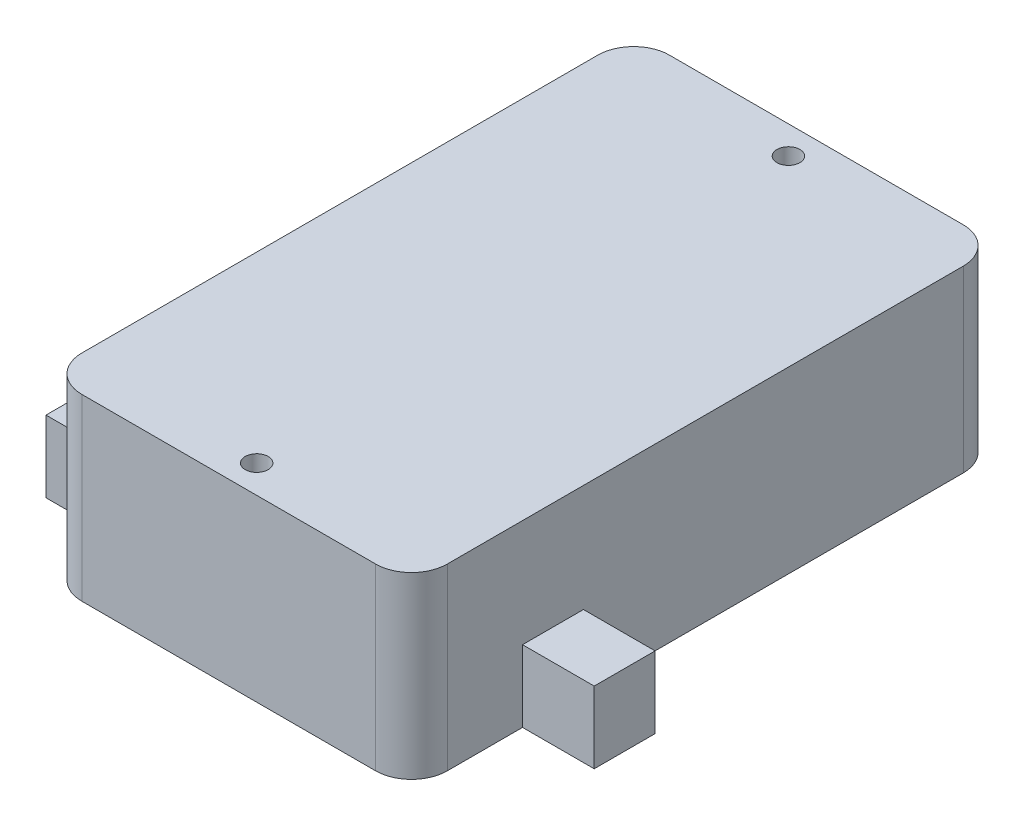
ISO-10303-21;
HEADER;
FILE_DESCRIPTION(('STEP AP214'),'2;1');
FILE_NAME('part.step','',(''),(''),'','','');
FILE_SCHEMA(('AUTOMOTIVE_DESIGN { 1 0 10303 214 1 1 1 1 }'));
ENDSEC;
DATA;
#1=APPLICATION_CONTEXT('core data for automotive mechanical design processes');
#2=APPLICATION_PROTOCOL_DEFINITION('international standard','automotive_design',2000,#1);
#3=PRODUCT_CONTEXT('',#1,'mechanical');
#4=PRODUCT('Part','Part','',(#3));
#5=PRODUCT_RELATED_PRODUCT_CATEGORY('part','',(#4));
#6=PRODUCT_DEFINITION_FORMATION('','',#4);
#7=PRODUCT_DEFINITION_CONTEXT('part definition',#1,'design');
#8=PRODUCT_DEFINITION('design','',#6,#7);
#9=PRODUCT_DEFINITION_SHAPE('','',#8);
#10=(LENGTH_UNIT() NAMED_UNIT(*) SI_UNIT(.MILLI.,.METRE.));
#11=(NAMED_UNIT(*) PLANE_ANGLE_UNIT() SI_UNIT($,.RADIAN.));
#12=(NAMED_UNIT(*) SI_UNIT($,.STERADIAN.) SOLID_ANGLE_UNIT());
#13=UNCERTAINTY_MEASURE_WITH_UNIT(LENGTH_MEASURE(1.E-05),#10,'distance_accuracy_value','');
#14=(GEOMETRIC_REPRESENTATION_CONTEXT(3) GLOBAL_UNCERTAINTY_ASSIGNED_CONTEXT((#13)) GLOBAL_UNIT_ASSIGNED_CONTEXT((#10,
#11,#12)) REPRESENTATION_CONTEXT('',''));
#15=CARTESIAN_POINT('',(0.,0.,0.));
#16=DIRECTION('',(0.,0.,1.));
#17=DIRECTION('',(1.,0.,0.));
#18=AXIS2_PLACEMENT_3D('',#15,#16,#17);
#19=CARTESIAN_POINT('',(25.5,25.,0.));
#20=DIRECTION('',(-1.,0.,0.));
#21=DIRECTION('',(0.,0.,1.));
#22=AXIS2_PLACEMENT_3D('',#19,#20,#21);
#23=PLANE('',#22);
#24=DIRECTION('',(0.,0.,-1.));
#25=VECTOR('',#24,1.);
#26=CARTESIAN_POINT('',(25.5,0.,0.));
#27=LINE('',#26,#25);
#28=CARTESIAN_POINT('',(25.5,0.,17.));
#29=VERTEX_POINT('',#28);
#30=CARTESIAN_POINT('',(25.5,0.,-36.));
#31=VERTEX_POINT('',#30);
#32=EDGE_CURVE('E229',#29,#31,#27,.T.);
#33=ORIENTED_EDGE('',*,*,#32,.T.);
#34=DIRECTION('',(0.,-1.,0.));
#35=VECTOR('',#34,1.);
#36=CARTESIAN_POINT('',(25.5,25.,-36.));
#37=LINE('',#36,#35);
#38=CARTESIAN_POINT('',(25.5,25.,-36.));
#39=VERTEX_POINT('',#38);
#40=EDGE_CURVE('E48',#31,#39,#37,.F.);
#41=ORIENTED_EDGE('',*,*,#40,.T.);
#42=DIRECTION('',(0.,0.,-1.));
#43=VECTOR('',#42,1.);
#44=CARTESIAN_POINT('',(25.5,25.,0.));
#45=LINE('',#44,#43);
#46=CARTESIAN_POINT('',(25.5,25.,36.));
#47=VERTEX_POINT('',#46);
#48=EDGE_CURVE('E211',#47,#39,#45,.T.);
#49=ORIENTED_EDGE('',*,*,#48,.F.);
#50=DIRECTION('',(0.,-1.,0.));
#51=VECTOR('',#50,1.);
#52=CARTESIAN_POINT('',(25.5,25.,36.));
#53=LINE('',#52,#51);
#54=CARTESIAN_POINT('',(25.5,0.,36.));
#55=VERTEX_POINT('',#54);
#56=EDGE_CURVE('E267',#47,#55,#53,.T.);
#57=ORIENTED_EDGE('',*,*,#56,.T.);
#58=CARTESIAN_POINT('',(25.5,0.,25.5));
#59=VERTEX_POINT('',#58);
#60=EDGE_CURVE('E230',#55,#59,#27,.T.);
#61=ORIENTED_EDGE('',*,*,#60,.T.);
#62=DIRECTION('',(0.,-1.,0.));
#63=VECTOR('',#62,1.);
#64=CARTESIAN_POINT('',(25.5,10.,25.5));
#65=LINE('',#64,#63);
#66=CARTESIAN_POINT('',(25.5,10.,25.5));
#67=VERTEX_POINT('',#66);
#68=EDGE_CURVE('E192',#67,#59,#65,.T.);
#69=ORIENTED_EDGE('',*,*,#68,.F.);
#70=DIRECTION('',(0.,0.,-1.));
#71=VECTOR('',#70,1.);
#72=CARTESIAN_POINT('',(25.5,10.,0.));
#73=LINE('',#72,#71);
#74=CARTESIAN_POINT('',(25.5,10.,17.));
#75=VERTEX_POINT('',#74);
#76=EDGE_CURVE('E190',#67,#75,#73,.T.);
#77=ORIENTED_EDGE('',*,*,#76,.T.);
#78=DIRECTION('',(0.,-1.,0.));
#79=VECTOR('',#78,1.);
#80=CARTESIAN_POINT('',(25.5,10.,17.));
#81=LINE('',#80,#79);
#82=EDGE_CURVE('E200',#75,#29,#81,.T.);
#83=ORIENTED_EDGE('',*,*,#82,.T.);
#84=EDGE_LOOP('',(#33,#41,#49,#57,#61,#69,#77,#83));
#85=FACE_BOUND('',#84,.T.);
#86=ADVANCED_FACE('F33',(#85),#23,.F.);
#87=CARTESIAN_POINT('',(0.,25.,41.));
#88=DIRECTION('',(0.,0.,-1.));
#89=DIRECTION('',(-1.,0.,0.));
#90=AXIS2_PLACEMENT_3D('',#87,#88,#89);
#91=PLANE('',#90);
#92=DIRECTION('',(1.,0.,0.));
#93=VECTOR('',#92,1.);
#94=CARTESIAN_POINT('',(0.,0.,41.));
#95=LINE('',#94,#93);
#96=CARTESIAN_POINT('',(-20.5,0.,41.));
#97=VERTEX_POINT('',#96);
#98=CARTESIAN_POINT('',(20.5,0.,41.));
#99=VERTEX_POINT('',#98);
#100=EDGE_CURVE('E208',#97,#99,#95,.T.);
#101=ORIENTED_EDGE('',*,*,#100,.T.);
#102=DIRECTION('',(0.,-1.,0.));
#103=VECTOR('',#102,1.);
#104=CARTESIAN_POINT('',(20.5,25.,41.));
#105=LINE('',#104,#103);
#106=CARTESIAN_POINT('',(20.5,25.,41.));
#107=VERTEX_POINT('',#106);
#108=EDGE_CURVE('E11',#99,#107,#105,.F.);
#109=ORIENTED_EDGE('',*,*,#108,.T.);
#110=DIRECTION('',(1.,0.,0.));
#111=VECTOR('',#110,1.);
#112=CARTESIAN_POINT('',(0.,25.,41.));
#113=LINE('',#112,#111);
#114=CARTESIAN_POINT('',(-20.5,25.,41.));
#115=VERTEX_POINT('',#114);
#116=EDGE_CURVE('E209',#115,#107,#113,.T.);
#117=ORIENTED_EDGE('',*,*,#116,.F.);
#118=DIRECTION('',(0.,-1.,0.));
#119=VECTOR('',#118,1.);
#120=CARTESIAN_POINT('',(-20.5,0.,41.));
#121=LINE('',#120,#119);
#122=EDGE_CURVE('E41',#115,#97,#121,.T.);
#123=ORIENTED_EDGE('',*,*,#122,.T.);
#124=EDGE_LOOP('',(#101,#109,#117,#123));
#125=FACE_BOUND('',#124,.T.);
#126=ADVANCED_FACE('F275',(#125),#91,.F.);
#127=CARTESIAN_POINT('',(0.,25.,-41.));
#128=DIRECTION('',(0.,0.,-1.));
#129=DIRECTION('',(-1.,0.,0.));
#130=AXIS2_PLACEMENT_3D('',#127,#128,#129);
#131=PLANE('',#130);
#132=DIRECTION('',(1.,0.,0.));
#133=VECTOR('',#132,1.);
#134=CARTESIAN_POINT('',(0.,0.,-41.));
#135=LINE('',#134,#133);
#136=CARTESIAN_POINT('',(-20.5,0.,-41.));
#137=VERTEX_POINT('',#136);
#138=CARTESIAN_POINT('',(20.5,0.,-41.));
#139=VERTEX_POINT('',#138);
#140=EDGE_CURVE('E232',#137,#139,#135,.T.);
#141=ORIENTED_EDGE('',*,*,#140,.F.);
#142=DIRECTION('',(0.,-1.,0.));
#143=VECTOR('',#142,1.);
#144=CARTESIAN_POINT('',(-20.5,25.,-41.));
#145=LINE('',#144,#143);
#146=CARTESIAN_POINT('',(-20.5,25.,-41.));
#147=VERTEX_POINT('',#146);
#148=EDGE_CURVE('E258',#137,#147,#145,.F.);
#149=ORIENTED_EDGE('',*,*,#148,.T.);
#150=DIRECTION('',(1.,0.,0.));
#151=VECTOR('',#150,1.);
#152=CARTESIAN_POINT('',(0.,25.,-41.));
#153=LINE('',#152,#151);
#154=CARTESIAN_POINT('',(20.5,25.,-41.));
#155=VERTEX_POINT('',#154);
#156=EDGE_CURVE('E214',#147,#155,#153,.T.);
#157=ORIENTED_EDGE('',*,*,#156,.T.);
#158=DIRECTION('',(0.,-1.,0.));
#159=VECTOR('',#158,1.);
#160=CARTESIAN_POINT('',(20.5,0.,-41.));
#161=LINE('',#160,#159);
#162=EDGE_CURVE('E255',#155,#139,#161,.T.);
#163=ORIENTED_EDGE('',*,*,#162,.T.);
#164=EDGE_LOOP('',(#141,#149,#157,#163));
#165=FACE_BOUND('',#164,.T.);
#166=ADVANCED_FACE('F299',(#165),#131,.T.);
#167=CARTESIAN_POINT('',(0.,25.,37.1));
#168=DIRECTION('',(0.,-1.,0.));
#169=DIRECTION('',(0.,0.,-1.));
#170=AXIS2_PLACEMENT_3D('',#167,#168,#169);
#171=CYLINDRICAL_SURFACE('',#170,1.6);
#172=CARTESIAN_POINT('',(0.,25.,37.1));
#173=DIRECTION('',(0.,1.,0.));
#174=DIRECTION('',(0.,0.,1.));
#175=AXIS2_PLACEMENT_3D('',#172,#173,#174);
#176=CIRCLE('',#175,1.6);
#177=CARTESIAN_POINT('',(0.,25.,38.7));
#178=VERTEX_POINT('',#177);
#179=EDGE_CURVE('E220',#178,#178,#176,.T.);
#180=ORIENTED_EDGE('',*,*,#179,.T.);
#181=EDGE_LOOP('',(#180));
#182=FACE_BOUND('',#181,.T.);
#183=CARTESIAN_POINT('',(0.,0.,37.1));
#184=DIRECTION('',(0.,1.,0.));
#185=DIRECTION('',(0.,0.,1.));
#186=AXIS2_PLACEMENT_3D('',#183,#184,#185);
#187=CIRCLE('',#186,1.6);
#188=CARTESIAN_POINT('',(0.,0.,38.7));
#189=VERTEX_POINT('',#188);
#190=EDGE_CURVE('E238',#189,#189,#187,.T.);
#191=ORIENTED_EDGE('',*,*,#190,.F.);
#192=EDGE_LOOP('',(#191));
#193=FACE_BOUND('',#192,.T.);
#194=ADVANCED_FACE('F458',(#182,#193),#171,.F.);
#195=CARTESIAN_POINT('',(-25.5,25.,0.));
#196=DIRECTION('',(-1.,0.,0.));
#197=DIRECTION('',(0.,0.,1.));
#198=AXIS2_PLACEMENT_3D('',#195,#196,#197);
#199=PLANE('',#198);
#200=DIRECTION('',(0.,0.,-1.));
#201=VECTOR('',#200,1.);
#202=CARTESIAN_POINT('',(-25.5,25.,0.));
#203=LINE('',#202,#201);
#204=CARTESIAN_POINT('',(-25.5,25.,36.));
#205=VERTEX_POINT('',#204);
#206=CARTESIAN_POINT('',(-25.5,25.,-36.));
#207=VERTEX_POINT('',#206);
#208=EDGE_CURVE('E217',#205,#207,#203,.T.);
#209=ORIENTED_EDGE('',*,*,#208,.T.);
#210=DIRECTION('',(0.,-1.,0.));
#211=VECTOR('',#210,1.);
#212=CARTESIAN_POINT('',(-25.5,25.,-36.));
#213=LINE('',#212,#211);
#214=CARTESIAN_POINT('',(-25.5,0.,-36.));
#215=VERTEX_POINT('',#214);
#216=EDGE_CURVE('E244',#207,#215,#213,.T.);
#217=ORIENTED_EDGE('',*,*,#216,.T.);
#218=DIRECTION('',(0.,0.,-1.));
#219=VECTOR('',#218,1.);
#220=CARTESIAN_POINT('',(-25.5,0.,0.));
#221=LINE('',#220,#219);
#222=CARTESIAN_POINT('',(-25.5,0.,5.));
#223=VERTEX_POINT('',#222);
#224=EDGE_CURVE('E235',#223,#215,#221,.T.);
#225=ORIENTED_EDGE('',*,*,#224,.F.);
#226=DIRECTION('',(0.,-1.,0.));
#227=VECTOR('',#226,1.);
#228=CARTESIAN_POINT('',(-25.5,10.,5.));
#229=LINE('',#228,#227);
#230=CARTESIAN_POINT('',(-25.5,10.,5.));
#231=VERTEX_POINT('',#230);
#232=EDGE_CURVE('E512',#231,#223,#229,.T.);
#233=ORIENTED_EDGE('',*,*,#232,.F.);
#234=DIRECTION('',(0.,0.,-1.));
#235=VECTOR('',#234,1.);
#236=CARTESIAN_POINT('',(-25.5,10.,0.));
#237=LINE('',#236,#235);
#238=CARTESIAN_POINT('',(-25.5,10.,31.));
#239=VERTEX_POINT('',#238);
#240=EDGE_CURVE('E164',#239,#231,#237,.T.);
#241=ORIENTED_EDGE('',*,*,#240,.F.);
#242=DIRECTION('',(0.,-1.,0.));
#243=VECTOR('',#242,1.);
#244=CARTESIAN_POINT('',(-25.5,10.,31.));
#245=LINE('',#244,#243);
#246=CARTESIAN_POINT('',(-25.5,0.,31.));
#247=VERTEX_POINT('',#246);
#248=EDGE_CURVE('E177',#239,#247,#245,.T.);
#249=ORIENTED_EDGE('',*,*,#248,.T.);
#250=CARTESIAN_POINT('',(-25.5,0.,36.));
#251=VERTEX_POINT('',#250);
#252=EDGE_CURVE('E236',#251,#247,#221,.T.);
#253=ORIENTED_EDGE('',*,*,#252,.F.);
#254=DIRECTION('',(0.,-1.,0.));
#255=VECTOR('',#254,1.);
#256=CARTESIAN_POINT('',(-25.5,25.,36.));
#257=LINE('',#256,#255);
#258=EDGE_CURVE('E226',#251,#205,#257,.F.);
#259=ORIENTED_EDGE('',*,*,#258,.T.);
#260=EDGE_LOOP('',(#209,#217,#225,#233,#241,#249,#253,#259));
#261=FACE_BOUND('',#260,.T.);
#262=ADVANCED_FACE('F308',(#261),#199,.T.);
#263=CARTESIAN_POINT('',(0.,25.,-37.1));
#264=DIRECTION('',(0.,-1.,0.));
#265=DIRECTION('',(0.,0.,-1.));
#266=AXIS2_PLACEMENT_3D('',#263,#264,#265);
#267=CYLINDRICAL_SURFACE('',#266,1.6);
#268=CARTESIAN_POINT('',(0.,25.,-37.1));
#269=DIRECTION('',(0.,1.,0.));
#270=DIRECTION('',(0.,0.,1.));
#271=AXIS2_PLACEMENT_3D('',#268,#269,#270);
#272=CIRCLE('',#271,1.6);
#273=CARTESIAN_POINT('',(0.,25.,-35.5));
#274=VERTEX_POINT('',#273);
#275=EDGE_CURVE('E223',#274,#274,#272,.F.);
#276=ORIENTED_EDGE('',*,*,#275,.F.);
#277=EDGE_LOOP('',(#276));
#278=FACE_BOUND('',#277,.T.);
#279=CARTESIAN_POINT('',(0.,0.,-37.1));
#280=DIRECTION('',(0.,1.,0.));
#281=DIRECTION('',(0.,0.,1.));
#282=AXIS2_PLACEMENT_3D('',#279,#280,#281);
#283=CIRCLE('',#282,1.6);
#284=CARTESIAN_POINT('',(0.,0.,-35.5));
#285=VERTEX_POINT('',#284);
#286=EDGE_CURVE('E212',#285,#285,#283,.F.);
#287=ORIENTED_EDGE('',*,*,#286,.T.);
#288=EDGE_LOOP('',(#287));
#289=FACE_BOUND('',#288,.T.);
#290=ADVANCED_FACE('F442',(#278,#289),#267,.F.);
#291=CARTESIAN_POINT('',(0.,25.,0.));
#292=DIRECTION('',(0.,1.,0.));
#293=DIRECTION('',(0.,0.,1.));
#294=AXIS2_PLACEMENT_3D('',#291,#292,#293);
#295=PLANE('',#294);
#296=ORIENTED_EDGE('',*,*,#156,.F.);
#297=CARTESIAN_POINT('',(-20.5,25.,-36.));
#298=DIRECTION('',(0.,1.,0.));
#299=DIRECTION('',(0.,0.,1.));
#300=AXIS2_PLACEMENT_3D('',#297,#298,#299);
#301=CIRCLE('',#300,5.);
#302=EDGE_CURVE('E265',#147,#207,#301,.T.);
#303=ORIENTED_EDGE('',*,*,#302,.T.);
#304=ORIENTED_EDGE('',*,*,#208,.F.);
#305=CARTESIAN_POINT('',(-20.5,25.,36.));
#306=DIRECTION('',(0.,1.,0.));
#307=DIRECTION('',(0.,0.,1.));
#308=AXIS2_PLACEMENT_3D('',#305,#306,#307);
#309=CIRCLE('',#308,5.);
#310=EDGE_CURVE('E260',#205,#115,#309,.T.);
#311=ORIENTED_EDGE('',*,*,#310,.T.);
#312=ORIENTED_EDGE('',*,*,#116,.T.);
#313=CARTESIAN_POINT('',(20.5,25.,36.));
#314=DIRECTION('',(0.,1.,0.));
#315=DIRECTION('',(0.,0.,1.));
#316=AXIS2_PLACEMENT_3D('',#313,#314,#315);
#317=CIRCLE('',#316,5.);
#318=EDGE_CURVE('E55',#107,#47,#317,.T.);
#319=ORIENTED_EDGE('',*,*,#318,.T.);
#320=ORIENTED_EDGE('',*,*,#48,.T.);
#321=CARTESIAN_POINT('',(20.5,25.,-36.));
#322=DIRECTION('',(0.,1.,0.));
#323=DIRECTION('',(0.,0.,1.));
#324=AXIS2_PLACEMENT_3D('',#321,#322,#323);
#325=CIRCLE('',#324,5.);
#326=EDGE_CURVE('E263',#39,#155,#325,.T.);
#327=ORIENTED_EDGE('',*,*,#326,.T.);
#328=EDGE_LOOP('',(#296,#303,#304,#311,#312,#319,#320,#327));
#329=FACE_BOUND('',#328,.T.);
#330=ORIENTED_EDGE('',*,*,#179,.F.);
#331=EDGE_LOOP('',(#330));
#332=FACE_BOUND('',#331,.T.);
#333=ORIENTED_EDGE('',*,*,#275,.T.);
#334=EDGE_LOOP('',(#333));
#335=FACE_BOUND('',#334,.T.);
#336=ADVANCED_FACE('F292',(#329,#332,#335),#295,.T.);
#337=CARTESIAN_POINT('',(0.,0.,0.));
#338=DIRECTION('',(0.,1.,0.));
#339=DIRECTION('',(0.,0.,1.));
#340=AXIS2_PLACEMENT_3D('',#337,#338,#339);
#341=PLANE('',#340);
#342=ORIENTED_EDGE('',*,*,#224,.T.);
#343=CARTESIAN_POINT('',(-20.5,0.,-36.));
#344=DIRECTION('',(0.,1.,0.));
#345=DIRECTION('',(0.,0.,1.));
#346=AXIS2_PLACEMENT_3D('',#343,#344,#345);
#347=CIRCLE('',#346,5.);
#348=EDGE_CURVE('E253',#215,#137,#347,.F.);
#349=ORIENTED_EDGE('',*,*,#348,.T.);
#350=ORIENTED_EDGE('',*,*,#140,.T.);
#351=CARTESIAN_POINT('',(20.5,0.,-36.));
#352=DIRECTION('',(0.,1.,0.));
#353=DIRECTION('',(0.,0.,1.));
#354=AXIS2_PLACEMENT_3D('',#351,#352,#353);
#355=CIRCLE('',#354,5.);
#356=EDGE_CURVE('E251',#139,#31,#355,.F.);
#357=ORIENTED_EDGE('',*,*,#356,.T.);
#358=ORIENTED_EDGE('',*,*,#32,.F.);
#359=DIRECTION('',(1.,0.,0.));
#360=VECTOR('',#359,1.);
#361=CARTESIAN_POINT('',(0.,0.,17.));
#362=LINE('',#361,#360);
#363=CARTESIAN_POINT('',(35.5,0.,17.));
#364=VERTEX_POINT('',#363);
#365=EDGE_CURVE('E185',#29,#364,#362,.T.);
#366=ORIENTED_EDGE('',*,*,#365,.T.);
#367=DIRECTION('',(0.,0.,-1.));
#368=VECTOR('',#367,1.);
#369=CARTESIAN_POINT('',(35.5,0.,0.));
#370=LINE('',#369,#368);
#371=CARTESIAN_POINT('',(35.5,0.,25.5));
#372=VERTEX_POINT('',#371);
#373=EDGE_CURVE('E175',#372,#364,#370,.T.);
#374=ORIENTED_EDGE('',*,*,#373,.F.);
#375=DIRECTION('',(1.,0.,0.));
#376=VECTOR('',#375,1.);
#377=CARTESIAN_POINT('',(0.,0.,25.5));
#378=LINE('',#377,#376);
#379=EDGE_CURVE('E172',#59,#372,#378,.T.);
#380=ORIENTED_EDGE('',*,*,#379,.F.);
#381=ORIENTED_EDGE('',*,*,#60,.F.);
#382=CARTESIAN_POINT('',(20.5,0.,36.));
#383=DIRECTION('',(0.,1.,0.));
#384=DIRECTION('',(0.,0.,1.));
#385=AXIS2_PLACEMENT_3D('',#382,#383,#384);
#386=CIRCLE('',#385,5.);
#387=EDGE_CURVE('E249',#55,#99,#386,.F.);
#388=ORIENTED_EDGE('',*,*,#387,.T.);
#389=ORIENTED_EDGE('',*,*,#100,.F.);
#390=CARTESIAN_POINT('',(-20.5,0.,36.));
#391=DIRECTION('',(0.,1.,0.));
#392=DIRECTION('',(0.,0.,1.));
#393=AXIS2_PLACEMENT_3D('',#390,#391,#392);
#394=CIRCLE('',#393,5.);
#395=EDGE_CURVE('E247',#97,#251,#394,.F.);
#396=ORIENTED_EDGE('',*,*,#395,.T.);
#397=ORIENTED_EDGE('',*,*,#252,.T.);
#398=DIRECTION('',(-1.,0.,0.));
#399=VECTOR('',#398,1.);
#400=CARTESIAN_POINT('',(0.,0.,31.));
#401=LINE('',#400,#399);
#402=CARTESIAN_POINT('',(-35.5,0.,31.));
#403=VERTEX_POINT('',#402);
#404=EDGE_CURVE('E167',#247,#403,#401,.T.);
#405=ORIENTED_EDGE('',*,*,#404,.T.);
#406=DIRECTION('',(0.,0.,1.));
#407=VECTOR('',#406,1.);
#408=CARTESIAN_POINT('',(-35.5,0.,0.));
#409=LINE('',#408,#407);
#410=CARTESIAN_POINT('',(-35.5,0.,5.00000000000001));
#411=VERTEX_POINT('',#410);
#412=EDGE_CURVE('E510',#411,#403,#409,.T.);
#413=ORIENTED_EDGE('',*,*,#412,.F.);
#414=DIRECTION('',(-1.,0.,0.));
#415=VECTOR('',#414,1.);
#416=CARTESIAN_POINT('',(0.,0.,5.));
#417=LINE('',#416,#415);
#418=EDGE_CURVE('E171',#223,#411,#417,.T.);
#419=ORIENTED_EDGE('',*,*,#418,.F.);
#420=EDGE_LOOP('',(#342,#349,#350,#357,#358,#366,#374,#380,#381,#388,#389,#396,#397,#405,#413,#419));
#421=FACE_BOUND('',#420,.T.);
#422=ORIENTED_EDGE('',*,*,#190,.T.);
#423=EDGE_LOOP('',(#422));
#424=FACE_BOUND('',#423,.T.);
#425=ORIENTED_EDGE('',*,*,#286,.F.);
#426=EDGE_LOOP('',(#425));
#427=FACE_BOUND('',#426,.T.);
#428=ADVANCED_FACE('F281',(#421,#424,#427),#341,.F.);
#429=CARTESIAN_POINT('',(0.,10.,25.5));
#430=DIRECTION('',(0.,0.,-1.));
#431=DIRECTION('',(-1.,0.,0.));
#432=AXIS2_PLACEMENT_3D('',#429,#430,#431);
#433=PLANE('',#432);
#434=ORIENTED_EDGE('',*,*,#379,.T.);
#435=DIRECTION('',(0.,-1.,0.));
#436=VECTOR('',#435,1.);
#437=CARTESIAN_POINT('',(35.5,10.,25.5));
#438=LINE('',#437,#436);
#439=CARTESIAN_POINT('',(35.5,10.,25.5));
#440=VERTEX_POINT('',#439);
#441=EDGE_CURVE('E205',#440,#372,#438,.T.);
#442=ORIENTED_EDGE('',*,*,#441,.F.);
#443=DIRECTION('',(1.,0.,0.));
#444=VECTOR('',#443,1.);
#445=CARTESIAN_POINT('',(0.,10.,25.5));
#446=LINE('',#445,#444);
#447=EDGE_CURVE('E181',#67,#440,#446,.T.);
#448=ORIENTED_EDGE('',*,*,#447,.F.);
#449=ORIENTED_EDGE('',*,*,#68,.T.);
#450=EDGE_LOOP('',(#434,#442,#448,#449));
#451=FACE_BOUND('',#450,.T.);
#452=ADVANCED_FACE('F405',(#451),#433,.F.);
#453=CARTESIAN_POINT('',(35.5,10.,0.));
#454=DIRECTION('',(-1.,0.,0.));
#455=DIRECTION('',(0.,0.,1.));
#456=AXIS2_PLACEMENT_3D('',#453,#454,#455);
#457=PLANE('',#456);
#458=ORIENTED_EDGE('',*,*,#373,.T.);
#459=DIRECTION('',(0.,-1.,0.));
#460=VECTOR('',#459,1.);
#461=CARTESIAN_POINT('',(35.5,10.,17.));
#462=LINE('',#461,#460);
#463=CARTESIAN_POINT('',(35.5,10.,17.));
#464=VERTEX_POINT('',#463);
#465=EDGE_CURVE('E203',#464,#364,#462,.T.);
#466=ORIENTED_EDGE('',*,*,#465,.F.);
#467=DIRECTION('',(0.,0.,-1.));
#468=VECTOR('',#467,1.);
#469=CARTESIAN_POINT('',(35.5,10.,0.));
#470=LINE('',#469,#468);
#471=EDGE_CURVE('E184',#440,#464,#470,.T.);
#472=ORIENTED_EDGE('',*,*,#471,.F.);
#473=ORIENTED_EDGE('',*,*,#441,.T.);
#474=EDGE_LOOP('',(#458,#466,#472,#473));
#475=FACE_BOUND('',#474,.T.);
#476=ADVANCED_FACE('F396',(#475),#457,.F.);
#477=CARTESIAN_POINT('',(0.,10.,17.));
#478=DIRECTION('',(0.,0.,-1.));
#479=DIRECTION('',(-1.,0.,0.));
#480=AXIS2_PLACEMENT_3D('',#477,#478,#479);
#481=PLANE('',#480);
#482=ORIENTED_EDGE('',*,*,#365,.F.);
#483=ORIENTED_EDGE('',*,*,#82,.F.);
#484=DIRECTION('',(1.,0.,0.));
#485=VECTOR('',#484,1.);
#486=CARTESIAN_POINT('',(0.,10.,17.));
#487=LINE('',#486,#485);
#488=EDGE_CURVE('E187',#75,#464,#487,.T.);
#489=ORIENTED_EDGE('',*,*,#488,.T.);
#490=ORIENTED_EDGE('',*,*,#465,.T.);
#491=EDGE_LOOP('',(#482,#483,#489,#490));
#492=FACE_BOUND('',#491,.T.);
#493=ADVANCED_FACE('F387',(#492),#481,.T.);
#494=CARTESIAN_POINT('',(0.,10.,0.));
#495=DIRECTION('',(0.,1.,0.));
#496=DIRECTION('',(0.,0.,1.));
#497=AXIS2_PLACEMENT_3D('',#494,#495,#496);
#498=PLANE('',#497);
#499=ORIENTED_EDGE('',*,*,#447,.T.);
#500=ORIENTED_EDGE('',*,*,#471,.T.);
#501=ORIENTED_EDGE('',*,*,#488,.F.);
#502=ORIENTED_EDGE('',*,*,#76,.F.);
#503=EDGE_LOOP('',(#499,#500,#501,#502));
#504=FACE_BOUND('',#503,.T.);
#505=ADVANCED_FACE('F379',(#504),#498,.T.);
#506=CARTESIAN_POINT('',(0.,10.,5.));
#507=DIRECTION('',(0.,0.,1.));
#508=DIRECTION('',(1.,0.,0.));
#509=AXIS2_PLACEMENT_3D('',#506,#507,#508);
#510=PLANE('',#509);
#511=ORIENTED_EDGE('',*,*,#418,.T.);
#512=DIRECTION('',(0.,-1.,0.));
#513=VECTOR('',#512,1.);
#514=CARTESIAN_POINT('',(-35.5,10.,5.00000000000001));
#515=LINE('',#514,#513);
#516=CARTESIAN_POINT('',(-35.5,10.,5.00000000000001));
#517=VERTEX_POINT('',#516);
#518=EDGE_CURVE('E152',#517,#411,#515,.T.);
#519=ORIENTED_EDGE('',*,*,#518,.F.);
#520=DIRECTION('',(-1.,0.,0.));
#521=VECTOR('',#520,1.);
#522=CARTESIAN_POINT('',(0.,10.,5.));
#523=LINE('',#522,#521);
#524=EDGE_CURVE('E159',#231,#517,#523,.T.);
#525=ORIENTED_EDGE('',*,*,#524,.F.);
#526=ORIENTED_EDGE('',*,*,#232,.T.);
#527=EDGE_LOOP('',(#511,#519,#525,#526));
#528=FACE_BOUND('',#527,.T.);
#529=ADVANCED_FACE('F169',(#528),#510,.F.);
#530=CARTESIAN_POINT('',(-35.5,10.,0.));
#531=DIRECTION('',(1.,0.,0.));
#532=DIRECTION('',(0.,0.,-1.));
#533=AXIS2_PLACEMENT_3D('',#530,#531,#532);
#534=PLANE('',#533);
#535=ORIENTED_EDGE('',*,*,#412,.T.);
#536=DIRECTION('',(0.,-1.,0.));
#537=VECTOR('',#536,1.);
#538=CARTESIAN_POINT('',(-35.5,10.,31.));
#539=LINE('',#538,#537);
#540=CARTESIAN_POINT('',(-35.5,10.,31.));
#541=VERTEX_POINT('',#540);
#542=EDGE_CURVE('E154',#541,#403,#539,.T.);
#543=ORIENTED_EDGE('',*,*,#542,.F.);
#544=DIRECTION('',(0.,0.,1.));
#545=VECTOR('',#544,1.);
#546=CARTESIAN_POINT('',(-35.5,10.,0.));
#547=LINE('',#546,#545);
#548=EDGE_CURVE('E147',#517,#541,#547,.T.);
#549=ORIENTED_EDGE('',*,*,#548,.F.);
#550=ORIENTED_EDGE('',*,*,#518,.T.);
#551=EDGE_LOOP('',(#535,#543,#549,#550));
#552=FACE_BOUND('',#551,.T.);
#553=ADVANCED_FACE('F150',(#552),#534,.F.);
#554=CARTESIAN_POINT('',(0.,10.,31.));
#555=DIRECTION('',(0.,0.,1.));
#556=DIRECTION('',(1.,0.,0.));
#557=AXIS2_PLACEMENT_3D('',#554,#555,#556);
#558=PLANE('',#557);
#559=ORIENTED_EDGE('',*,*,#404,.F.);
#560=ORIENTED_EDGE('',*,*,#248,.F.);
#561=DIRECTION('',(-1.,0.,0.));
#562=VECTOR('',#561,1.);
#563=CARTESIAN_POINT('',(0.,10.,31.));
#564=LINE('',#563,#562);
#565=EDGE_CURVE('E158',#239,#541,#564,.T.);
#566=ORIENTED_EDGE('',*,*,#565,.T.);
#567=ORIENTED_EDGE('',*,*,#542,.T.);
#568=EDGE_LOOP('',(#559,#560,#566,#567));
#569=FACE_BOUND('',#568,.T.);
#570=ADVANCED_FACE('F356',(#569),#558,.T.);
#571=CARTESIAN_POINT('',(0.,10.,0.));
#572=DIRECTION('',(0.,1.,0.));
#573=DIRECTION('',(0.,0.,1.));
#574=AXIS2_PLACEMENT_3D('',#571,#572,#573);
#575=PLANE('',#574);
#576=ORIENTED_EDGE('',*,*,#524,.T.);
#577=ORIENTED_EDGE('',*,*,#548,.T.);
#578=ORIENTED_EDGE('',*,*,#565,.F.);
#579=ORIENTED_EDGE('',*,*,#240,.T.);
#580=EDGE_LOOP('',(#576,#577,#578,#579));
#581=FACE_BOUND('',#580,.T.);
#582=ADVANCED_FACE('F162',(#581),#575,.T.);
#583=CARTESIAN_POINT('',(-20.5,25.,-36.));
#584=DIRECTION('',(0.,-1.,0.));
#585=DIRECTION('',(0.,0.,-1.));
#586=AXIS2_PLACEMENT_3D('',#583,#584,#585);
#587=CYLINDRICAL_SURFACE('',#586,5.);
#588=ORIENTED_EDGE('',*,*,#302,.F.);
#589=ORIENTED_EDGE('',*,*,#148,.F.);
#590=ORIENTED_EDGE('',*,*,#348,.F.);
#591=ORIENTED_EDGE('',*,*,#216,.F.);
#592=EDGE_LOOP('',(#588,#589,#590,#591));
#593=FACE_BOUND('',#592,.T.);
#594=ADVANCED_FACE('F306',(#593),#587,.T.);
#595=CARTESIAN_POINT('',(20.5,25.,-36.));
#596=DIRECTION('',(0.,1.,0.));
#597=DIRECTION('',(0.,0.,1.));
#598=AXIS2_PLACEMENT_3D('',#595,#596,#597);
#599=CYLINDRICAL_SURFACE('',#598,5.);
#600=ORIENTED_EDGE('',*,*,#326,.F.);
#601=ORIENTED_EDGE('',*,*,#40,.F.);
#602=ORIENTED_EDGE('',*,*,#356,.F.);
#603=ORIENTED_EDGE('',*,*,#162,.F.);
#604=EDGE_LOOP('',(#600,#601,#602,#603));
#605=FACE_BOUND('',#604,.T.);
#606=ADVANCED_FACE('F296',(#605),#599,.T.);
#607=CARTESIAN_POINT('',(20.5,25.,36.));
#608=DIRECTION('',(0.,-1.,0.));
#609=DIRECTION('',(0.,0.,-1.));
#610=AXIS2_PLACEMENT_3D('',#607,#608,#609);
#611=CYLINDRICAL_SURFACE('',#610,5.);
#612=ORIENTED_EDGE('',*,*,#318,.F.);
#613=ORIENTED_EDGE('',*,*,#108,.F.);
#614=ORIENTED_EDGE('',*,*,#387,.F.);
#615=ORIENTED_EDGE('',*,*,#56,.F.);
#616=EDGE_LOOP('',(#612,#613,#614,#615));
#617=FACE_BOUND('',#616,.T.);
#618=ADVANCED_FACE('F288',(#617),#611,.T.);
#619=CARTESIAN_POINT('',(-20.5,25.,36.));
#620=DIRECTION('',(0.,1.,0.));
#621=DIRECTION('',(0.,0.,1.));
#622=AXIS2_PLACEMENT_3D('',#619,#620,#621);
#623=CYLINDRICAL_SURFACE('',#622,5.);
#624=ORIENTED_EDGE('',*,*,#310,.F.);
#625=ORIENTED_EDGE('',*,*,#258,.F.);
#626=ORIENTED_EDGE('',*,*,#395,.F.);
#627=ORIENTED_EDGE('',*,*,#122,.F.);
#628=EDGE_LOOP('',(#624,#625,#626,#627));
#629=FACE_BOUND('',#628,.T.);
#630=ADVANCED_FACE('F35',(#629),#623,.T.);
#631=CLOSED_SHELL('',(#86,#126,#166,#194,#262,#290,#336,#428,#452,#476,#493,#505,#529,#553,#570,
#582,#594,#606,#618,#630));
#632=MANIFOLD_SOLID_BREP('B2',#631);
#633=ADVANCED_BREP_SHAPE_REPRESENTATION('',(#18,#632),#14);
#634=SHAPE_DEFINITION_REPRESENTATION(#9,#633);
ENDSEC;
END-ISO-10303-21;
